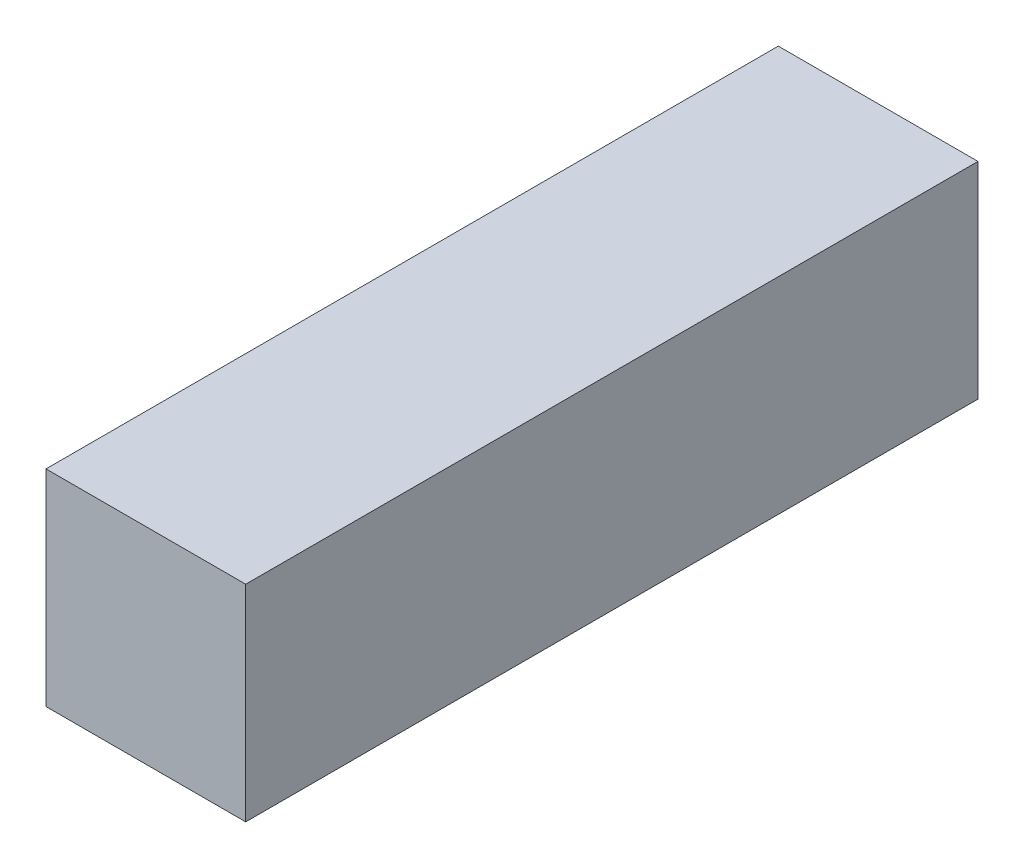
ISO-10303-21;
HEADER;
FILE_DESCRIPTION(('STEP AP214'),'2;1');
FILE_NAME('part.step','',(''),(''),'','','');
FILE_SCHEMA(('AUTOMOTIVE_DESIGN { 1 0 10303 214 1 1 1 1 }'));
ENDSEC;
DATA;
#1=APPLICATION_CONTEXT('core data for automotive mechanical design processes');
#2=APPLICATION_PROTOCOL_DEFINITION('international standard','automotive_design',2000,#1);
#3=PRODUCT_CONTEXT('',#1,'mechanical');
#4=PRODUCT('Part','Part','',(#3));
#5=PRODUCT_RELATED_PRODUCT_CATEGORY('part','',(#4));
#6=PRODUCT_DEFINITION_FORMATION('','',#4);
#7=PRODUCT_DEFINITION_CONTEXT('part definition',#1,'design');
#8=PRODUCT_DEFINITION('design','',#6,#7);
#9=PRODUCT_DEFINITION_SHAPE('','',#8);
#10=(LENGTH_UNIT() NAMED_UNIT(*) SI_UNIT(.MILLI.,.METRE.));
#11=(NAMED_UNIT(*) PLANE_ANGLE_UNIT() SI_UNIT($,.RADIAN.));
#12=(NAMED_UNIT(*) SI_UNIT($,.STERADIAN.) SOLID_ANGLE_UNIT());
#13=UNCERTAINTY_MEASURE_WITH_UNIT(LENGTH_MEASURE(1.E-05),#10,'distance_accuracy_value','');
#14=(GEOMETRIC_REPRESENTATION_CONTEXT(3) GLOBAL_UNCERTAINTY_ASSIGNED_CONTEXT((#13)) GLOBAL_UNIT_ASSIGNED_CONTEXT((#10,
#11,#12)) REPRESENTATION_CONTEXT('',''));
#15=CARTESIAN_POINT('',(0.,0.,0.));
#16=DIRECTION('',(0.,0.,1.));
#17=DIRECTION('',(1.,0.,0.));
#18=AXIS2_PLACEMENT_3D('',#15,#16,#17);
#19=CARTESIAN_POINT('',(1.499997,3.092196,5.499989));
#20=DIRECTION('',(-1.,0.,0.));
#21=DIRECTION('',(0.,0.,1.));
#22=AXIS2_PLACEMENT_3D('',#19,#20,#21);
#23=PLANE('',#22);
#24=DIRECTION('',(0.,0.,-1.));
#25=VECTOR('',#24,1.);
#26=CARTESIAN_POINT('',(1.499997,0.,5.499989));
#27=LINE('',#26,#25);
#28=CARTESIAN_POINT('',(1.499997,0.,5.499989));
#29=VERTEX_POINT('',#28);
#30=CARTESIAN_POINT('',(1.499997,0.,-5.499989));
#31=VERTEX_POINT('',#30);
#32=EDGE_CURVE('E113',#29,#31,#27,.T.);
#33=ORIENTED_EDGE('',*,*,#32,.T.);
#34=DIRECTION('',(0.,-1.,0.));
#35=VECTOR('',#34,1.);
#36=CARTESIAN_POINT('',(1.499997,3.092196,-5.499989));
#37=LINE('',#36,#35);
#38=CARTESIAN_POINT('',(1.499997,3.092196,-5.499989));
#39=VERTEX_POINT('',#38);
#40=EDGE_CURVE('E11',#39,#31,#37,.T.);
#41=ORIENTED_EDGE('',*,*,#40,.F.);
#42=DIRECTION('',(0.,0.,-1.));
#43=VECTOR('',#42,1.);
#44=CARTESIAN_POINT('',(1.499997,3.092196,5.499989));
#45=LINE('',#44,#43);
#46=CARTESIAN_POINT('',(1.499997,3.092196,5.499989));
#47=VERTEX_POINT('',#46);
#48=EDGE_CURVE('E97',#47,#39,#45,.T.);
#49=ORIENTED_EDGE('',*,*,#48,.F.);
#50=DIRECTION('',(0.,-1.,0.));
#51=VECTOR('',#50,1.);
#52=CARTESIAN_POINT('',(1.499997,3.092196,5.499989));
#53=LINE('',#52,#51);
#54=EDGE_CURVE('E109',#47,#29,#53,.T.);
#55=ORIENTED_EDGE('',*,*,#54,.T.);
#56=EDGE_LOOP('',(#33,#41,#49,#55));
#57=FACE_BOUND('',#56,.T.);
#58=ADVANCED_FACE('F45',(#57),#23,.F.);
#59=CARTESIAN_POINT('',(-1.499997,3.092196,-5.499989));
#60=DIRECTION('',(0.,0.,1.));
#61=DIRECTION('',(1.,0.,0.));
#62=AXIS2_PLACEMENT_3D('',#59,#60,#61);
#63=PLANE('',#62);
#64=DIRECTION('',(-1.,0.,0.));
#65=VECTOR('',#64,1.);
#66=CARTESIAN_POINT('',(-1.499997,0.,-5.499989));
#67=LINE('',#66,#65);
#68=CARTESIAN_POINT('',(-1.499997,0.,-5.499989));
#69=VERTEX_POINT('',#68);
#70=EDGE_CURVE('E102',#31,#69,#67,.T.);
#71=ORIENTED_EDGE('',*,*,#70,.T.);
#72=DIRECTION('',(0.,-1.,0.));
#73=VECTOR('',#72,1.);
#74=CARTESIAN_POINT('',(-1.499997,3.092196,-5.499989));
#75=LINE('',#74,#73);
#76=CARTESIAN_POINT('',(-1.499997,3.092196,-5.499989));
#77=VERTEX_POINT('',#76);
#78=EDGE_CURVE('E54',#77,#69,#75,.T.);
#79=ORIENTED_EDGE('',*,*,#78,.F.);
#80=DIRECTION('',(-1.,0.,0.));
#81=VECTOR('',#80,1.);
#82=CARTESIAN_POINT('',(-1.499997,3.092196,-5.499989));
#83=LINE('',#82,#81);
#84=EDGE_CURVE('E92',#39,#77,#83,.T.);
#85=ORIENTED_EDGE('',*,*,#84,.F.);
#86=ORIENTED_EDGE('',*,*,#40,.T.);
#87=EDGE_LOOP('',(#71,#79,#85,#86));
#88=FACE_BOUND('',#87,.T.);
#89=ADVANCED_FACE('F101',(#88),#63,.F.);
#90=CARTESIAN_POINT('',(-1.499997,3.092196,5.499989));
#91=DIRECTION('',(1.,0.,0.));
#92=DIRECTION('',(0.,0.,-1.));
#93=AXIS2_PLACEMENT_3D('',#90,#91,#92);
#94=PLANE('',#93);
#95=DIRECTION('',(0.,0.,1.));
#96=VECTOR('',#95,1.);
#97=CARTESIAN_POINT('',(-1.499997,0.,5.499989));
#98=LINE('',#97,#96);
#99=CARTESIAN_POINT('',(-1.499997,0.,5.499989));
#100=VERTEX_POINT('',#99);
#101=EDGE_CURVE('E79',#69,#100,#98,.T.);
#102=ORIENTED_EDGE('',*,*,#101,.T.);
#103=DIRECTION('',(0.,-1.,0.));
#104=VECTOR('',#103,1.);
#105=CARTESIAN_POINT('',(-1.499997,3.092196,5.499989));
#106=LINE('',#105,#104);
#107=CARTESIAN_POINT('',(-1.499997,3.092196,5.499989));
#108=VERTEX_POINT('',#107);
#109=EDGE_CURVE('E104',#108,#100,#106,.T.);
#110=ORIENTED_EDGE('',*,*,#109,.F.);
#111=DIRECTION('',(0.,0.,1.));
#112=VECTOR('',#111,1.);
#113=CARTESIAN_POINT('',(-1.499997,3.092196,5.499989));
#114=LINE('',#113,#112);
#115=EDGE_CURVE('E95',#77,#108,#114,.T.);
#116=ORIENTED_EDGE('',*,*,#115,.F.);
#117=ORIENTED_EDGE('',*,*,#78,.T.);
#118=EDGE_LOOP('',(#102,#110,#116,#117));
#119=FACE_BOUND('',#118,.T.);
#120=ADVANCED_FACE('F105',(#119),#94,.F.);
#121=CARTESIAN_POINT('',(-1.499997,3.092196,5.499989));
#122=DIRECTION('',(0.,0.,-1.));
#123=DIRECTION('',(-1.,0.,0.));
#124=AXIS2_PLACEMENT_3D('',#121,#122,#123);
#125=PLANE('',#124);
#126=DIRECTION('',(1.,0.,0.));
#127=VECTOR('',#126,1.);
#128=CARTESIAN_POINT('',(-1.499997,0.,5.499989));
#129=LINE('',#128,#127);
#130=EDGE_CURVE('E85',#100,#29,#129,.T.);
#131=ORIENTED_EDGE('',*,*,#130,.T.);
#132=ORIENTED_EDGE('',*,*,#54,.F.);
#133=DIRECTION('',(1.,0.,0.));
#134=VECTOR('',#133,1.);
#135=CARTESIAN_POINT('',(-1.499997,3.092196,5.499989));
#136=LINE('',#135,#134);
#137=EDGE_CURVE('E62',#108,#47,#136,.T.);
#138=ORIENTED_EDGE('',*,*,#137,.F.);
#139=ORIENTED_EDGE('',*,*,#109,.T.);
#140=EDGE_LOOP('',(#131,#132,#138,#139));
#141=FACE_BOUND('',#140,.T.);
#142=ADVANCED_FACE('F126',(#141),#125,.F.);
#143=CARTESIAN_POINT('',(0.,3.092196,0.));
#144=DIRECTION('',(0.,-1.,0.));
#145=DIRECTION('',(0.,0.,-1.));
#146=AXIS2_PLACEMENT_3D('',#143,#144,#145);
#147=PLANE('',#146);
#148=ORIENTED_EDGE('',*,*,#48,.T.);
#149=ORIENTED_EDGE('',*,*,#84,.T.);
#150=ORIENTED_EDGE('',*,*,#115,.T.);
#151=ORIENTED_EDGE('',*,*,#137,.T.);
#152=EDGE_LOOP('',(#148,#149,#150,#151));
#153=FACE_BOUND('',#152,.T.);
#154=ADVANCED_FACE('F93',(#153),#147,.F.);
#155=CARTESIAN_POINT('',(0.,0.,0.));
#156=DIRECTION('',(0.,-1.,0.));
#157=DIRECTION('',(0.,0.,-1.));
#158=AXIS2_PLACEMENT_3D('',#155,#156,#157);
#159=PLANE('',#158);
#160=ORIENTED_EDGE('',*,*,#32,.F.);
#161=ORIENTED_EDGE('',*,*,#130,.F.);
#162=ORIENTED_EDGE('',*,*,#101,.F.);
#163=ORIENTED_EDGE('',*,*,#70,.F.);
#164=EDGE_LOOP('',(#160,#161,#162,#163));
#165=FACE_BOUND('',#164,.T.);
#166=ADVANCED_FACE('F129',(#165),#159,.T.);
#167=CLOSED_SHELL('',(#58,#89,#120,#142,#154,#166));
#168=MANIFOLD_SOLID_BREP('B2',#167);
#169=ADVANCED_BREP_SHAPE_REPRESENTATION('',(#18,#168),#14);
#170=SHAPE_DEFINITION_REPRESENTATION(#9,#169);
ENDSEC;
END-ISO-10303-21;
